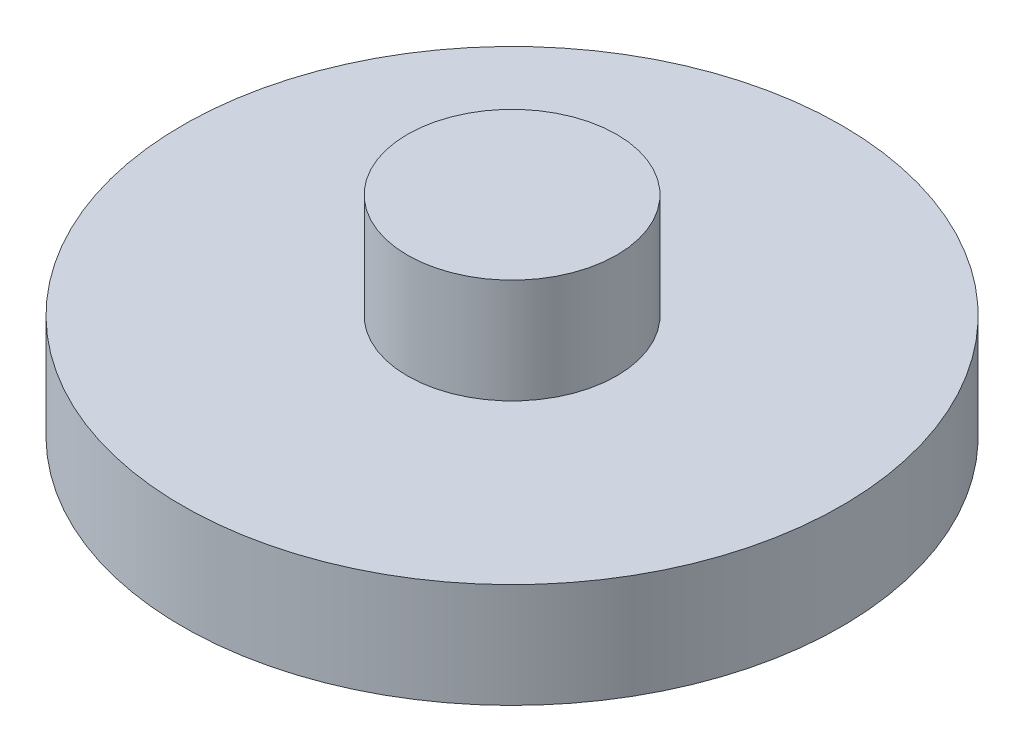
ISO-10303-21;
HEADER;
FILE_DESCRIPTION(('STEP AP214'),'2;1');
FILE_NAME('part.step','',(''),(''),'','','');
FILE_SCHEMA(('AUTOMOTIVE_DESIGN { 1 0 10303 214 1 1 1 1 }'));
ENDSEC;
DATA;
#1=APPLICATION_CONTEXT('core data for automotive mechanical design processes');
#2=APPLICATION_PROTOCOL_DEFINITION('international standard','automotive_design',2000,#1);
#3=PRODUCT_CONTEXT('',#1,'mechanical');
#4=PRODUCT('Part','Part','',(#3));
#5=PRODUCT_RELATED_PRODUCT_CATEGORY('part','',(#4));
#6=PRODUCT_DEFINITION_FORMATION('','',#4);
#7=PRODUCT_DEFINITION_CONTEXT('part definition',#1,'design');
#8=PRODUCT_DEFINITION('design','',#6,#7);
#9=PRODUCT_DEFINITION_SHAPE('','',#8);
#10=(LENGTH_UNIT() NAMED_UNIT(*) SI_UNIT(.MILLI.,.METRE.));
#11=(NAMED_UNIT(*) PLANE_ANGLE_UNIT() SI_UNIT($,.RADIAN.));
#12=(NAMED_UNIT(*) SI_UNIT($,.STERADIAN.) SOLID_ANGLE_UNIT());
#13=UNCERTAINTY_MEASURE_WITH_UNIT(LENGTH_MEASURE(1.E-05),#10,'distance_accuracy_value','');
#14=(GEOMETRIC_REPRESENTATION_CONTEXT(3) GLOBAL_UNCERTAINTY_ASSIGNED_CONTEXT((#13)) GLOBAL_UNIT_ASSIGNED_CONTEXT((#10,
#11,#12)) REPRESENTATION_CONTEXT('',''));
#15=CARTESIAN_POINT('',(0.,0.,0.));
#16=DIRECTION('',(0.,0.,1.));
#17=DIRECTION('',(1.,0.,0.));
#18=AXIS2_PLACEMENT_3D('',#15,#16,#17);
#19=CARTESIAN_POINT('',(0.,0.,0.));
#20=DIRECTION('',(0.,1.,0.));
#21=DIRECTION('',(0.,0.,1.));
#22=AXIS2_PLACEMENT_3D('',#19,#20,#21);
#23=PLANE('',#22);
#24=CARTESIAN_POINT('',(0.,0.,0.));
#25=DIRECTION('',(0.,-1.,0.));
#26=DIRECTION('',(0.,0.,-1.));
#27=AXIS2_PLACEMENT_3D('',#24,#25,#26);
#28=CIRCLE('',#27,15.75);
#29=CARTESIAN_POINT('',(0.,0.,-15.75));
#30=VERTEX_POINT('',#29);
#31=EDGE_CURVE('E10',#30,#30,#28,.T.);
#32=ORIENTED_EDGE('',*,*,#31,.T.);
#33=EDGE_LOOP('',(#32));
#34=FACE_BOUND('',#33,.T.);
#35=ADVANCED_FACE('F31',(#34),#23,.F.);
#36=CARTESIAN_POINT('',(0.,0.,0.));
#37=DIRECTION('',(0.,-1.,0.));
#38=DIRECTION('',(0.,0.,-1.));
#39=AXIS2_PLACEMENT_3D('',#36,#37,#38);
#40=CYLINDRICAL_SURFACE('',#39,15.75);
#41=ORIENTED_EDGE('',*,*,#31,.F.);
#42=EDGE_LOOP('',(#41));
#43=FACE_BOUND('',#42,.T.);
#44=CARTESIAN_POINT('',(0.,5.,0.));
#45=DIRECTION('',(0.,-1.,0.));
#46=DIRECTION('',(0.,0.,-1.));
#47=AXIS2_PLACEMENT_3D('',#44,#45,#46);
#48=CIRCLE('',#47,15.75);
#49=CARTESIAN_POINT('',(0.,5.,-15.75));
#50=VERTEX_POINT('',#49);
#51=EDGE_CURVE('E37',#50,#50,#48,.T.);
#52=ORIENTED_EDGE('',*,*,#51,.T.);
#53=EDGE_LOOP('',(#52));
#54=FACE_BOUND('',#53,.T.);
#55=ADVANCED_FACE('F63',(#43,#54),#40,.T.);
#56=CARTESIAN_POINT('',(-15.75,5.,0.));
#57=DIRECTION('',(0.,-1.,0.));
#58=DIRECTION('',(0.,0.,-1.));
#59=AXIS2_PLACEMENT_3D('',#56,#57,#58);
#60=PLANE('',#59);
#61=ORIENTED_EDGE('',*,*,#51,.F.);
#62=EDGE_LOOP('',(#61));
#63=FACE_BOUND('',#62,.T.);
#64=CARTESIAN_POINT('',(0.,5.,0.));
#65=DIRECTION('',(0.,-1.,0.));
#66=DIRECTION('',(0.,0.,-1.));
#67=AXIS2_PLACEMENT_3D('',#64,#65,#66);
#68=CIRCLE('',#67,5.);
#69=CARTESIAN_POINT('',(0.,5.,-5.));
#70=VERTEX_POINT('',#69);
#71=EDGE_CURVE('E41',#70,#70,#68,.T.);
#72=ORIENTED_EDGE('',*,*,#71,.T.);
#73=EDGE_LOOP('',(#72));
#74=FACE_BOUND('',#73,.T.);
#75=ADVANCED_FACE('F59',(#63,#74),#60,.F.);
#76=CARTESIAN_POINT('',(0.,0.,0.));
#77=DIRECTION('',(0.,-1.,0.));
#78=DIRECTION('',(0.,0.,-1.));
#79=AXIS2_PLACEMENT_3D('',#76,#77,#78);
#80=CYLINDRICAL_SURFACE('',#79,5.);
#81=ORIENTED_EDGE('',*,*,#71,.F.);
#82=EDGE_LOOP('',(#81));
#83=FACE_BOUND('',#82,.T.);
#84=CARTESIAN_POINT('',(0.,10.,0.));
#85=DIRECTION('',(0.,-1.,0.));
#86=DIRECTION('',(0.,0.,-1.));
#87=AXIS2_PLACEMENT_3D('',#84,#85,#86);
#88=CIRCLE('',#87,5.);
#89=CARTESIAN_POINT('',(0.,10.,-5.));
#90=VERTEX_POINT('',#89);
#91=EDGE_CURVE('E45',#90,#90,#88,.T.);
#92=ORIENTED_EDGE('',*,*,#91,.T.);
#93=EDGE_LOOP('',(#92));
#94=FACE_BOUND('',#93,.T.);
#95=ADVANCED_FACE('F51',(#83,#94),#80,.T.);
#96=CARTESIAN_POINT('',(-5.,10.,0.));
#97=DIRECTION('',(0.,-1.,0.));
#98=DIRECTION('',(0.,0.,-1.));
#99=AXIS2_PLACEMENT_3D('',#96,#97,#98);
#100=PLANE('',#99);
#101=ORIENTED_EDGE('',*,*,#91,.F.);
#102=EDGE_LOOP('',(#101));
#103=FACE_BOUND('',#102,.T.);
#104=ADVANCED_FACE('F53',(#103),#100,.F.);
#105=CLOSED_SHELL('',(#35,#55,#75,#95,#104));
#106=MANIFOLD_SOLID_BREP('B2',#105);
#107=ADVANCED_BREP_SHAPE_REPRESENTATION('',(#18,#106),#14);
#108=SHAPE_DEFINITION_REPRESENTATION(#9,#107);
ENDSEC;
END-ISO-10303-21;
